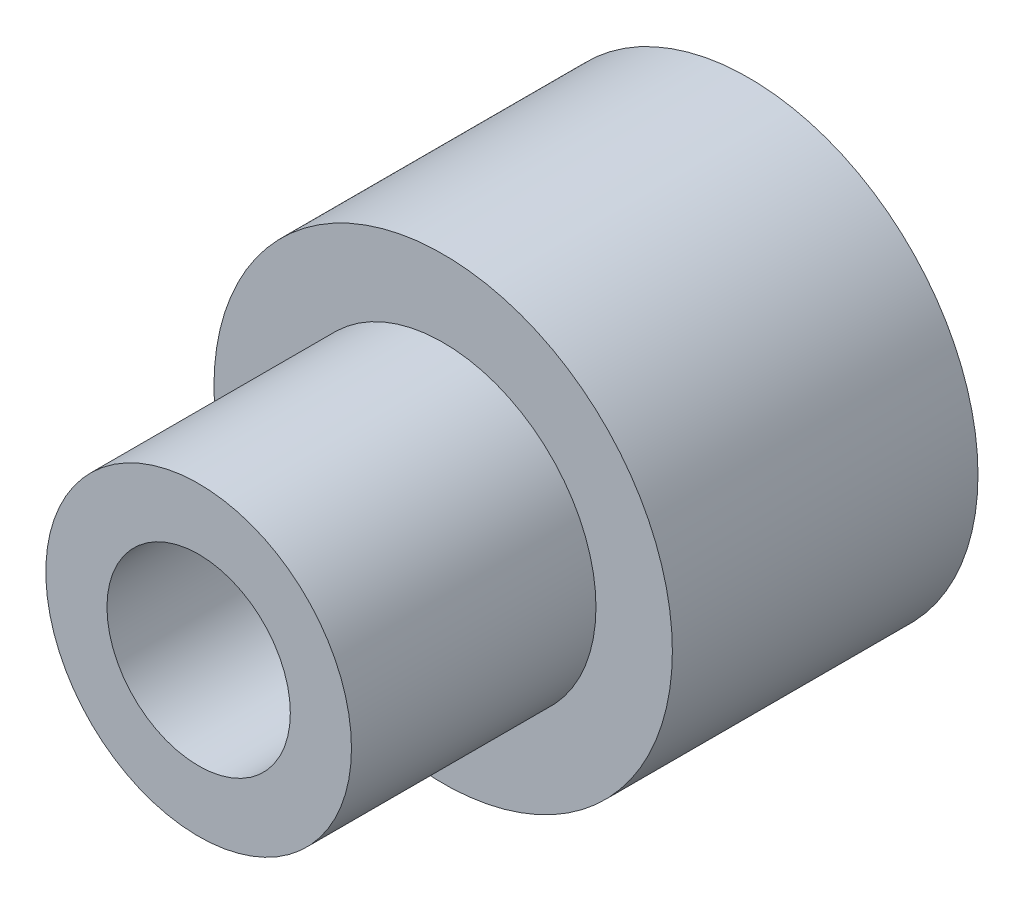
ISO-10303-21;
HEADER;
FILE_DESCRIPTION(('STEP AP214'),'2;1');
FILE_NAME('part.step','',(''),(''),'','','');
FILE_SCHEMA(('AUTOMOTIVE_DESIGN { 1 0 10303 214 1 1 1 1 }'));
ENDSEC;
DATA;
#1=APPLICATION_CONTEXT('core data for automotive mechanical design processes');
#2=APPLICATION_PROTOCOL_DEFINITION('international standard','automotive_design',2000,#1);
#3=PRODUCT_CONTEXT('',#1,'mechanical');
#4=PRODUCT('Part','Part','',(#3));
#5=PRODUCT_RELATED_PRODUCT_CATEGORY('part','',(#4));
#6=PRODUCT_DEFINITION_FORMATION('','',#4);
#7=PRODUCT_DEFINITION_CONTEXT('part definition',#1,'design');
#8=PRODUCT_DEFINITION('design','',#6,#7);
#9=PRODUCT_DEFINITION_SHAPE('','',#8);
#10=(LENGTH_UNIT() NAMED_UNIT(*) SI_UNIT(.MILLI.,.METRE.));
#11=(NAMED_UNIT(*) PLANE_ANGLE_UNIT() SI_UNIT($,.RADIAN.));
#12=(NAMED_UNIT(*) SI_UNIT($,.STERADIAN.) SOLID_ANGLE_UNIT());
#13=UNCERTAINTY_MEASURE_WITH_UNIT(LENGTH_MEASURE(1.E-05),#10,'distance_accuracy_value','');
#14=(GEOMETRIC_REPRESENTATION_CONTEXT(3) GLOBAL_UNCERTAINTY_ASSIGNED_CONTEXT((#13)) GLOBAL_UNIT_ASSIGNED_CONTEXT((#10,
#11,#12)) REPRESENTATION_CONTEXT('',''));
#15=CARTESIAN_POINT('',(0.,0.,0.));
#16=DIRECTION('',(0.,0.,1.));
#17=DIRECTION('',(1.,0.,0.));
#18=AXIS2_PLACEMENT_3D('',#15,#16,#17);
#19=CARTESIAN_POINT('',(0.,0.,10.));
#20=DIRECTION('',(0.,0.,-1.));
#21=DIRECTION('',(-1.,0.,0.));
#22=AXIS2_PLACEMENT_3D('',#19,#20,#21);
#23=CYLINDRICAL_SURFACE('',#22,7.5);
#24=CARTESIAN_POINT('',(0.,0.,10.));
#25=DIRECTION('',(0.,0.,1.));
#26=DIRECTION('',(1.,0.,0.));
#27=AXIS2_PLACEMENT_3D('',#24,#25,#26);
#28=CIRCLE('',#27,7.5);
#29=CARTESIAN_POINT('',(7.5,0.,10.));
#30=VERTEX_POINT('',#29);
#31=EDGE_CURVE('E44',#30,#30,#28,.T.);
#32=ORIENTED_EDGE('',*,*,#31,.F.);
#33=EDGE_LOOP('',(#32));
#34=FACE_BOUND('',#33,.T.);
#35=CARTESIAN_POINT('',(0.,0.,0.));
#36=DIRECTION('',(0.,0.,1.));
#37=DIRECTION('',(1.,0.,0.));
#38=AXIS2_PLACEMENT_3D('',#35,#36,#37);
#39=CIRCLE('',#38,7.5);
#40=CARTESIAN_POINT('',(7.5,0.,0.));
#41=VERTEX_POINT('',#40);
#42=EDGE_CURVE('E49',#41,#41,#39,.T.);
#43=ORIENTED_EDGE('',*,*,#42,.T.);
#44=EDGE_LOOP('',(#43));
#45=FACE_BOUND('',#44,.T.);
#46=ADVANCED_FACE('F37',(#34,#45),#23,.T.);
#47=CARTESIAN_POINT('',(0.,0.,10.));
#48=DIRECTION('',(0.,0.,1.));
#49=DIRECTION('',(1.,0.,0.));
#50=AXIS2_PLACEMENT_3D('',#47,#48,#49);
#51=PLANE('',#50);
#52=CARTESIAN_POINT('',(0.,0.,10.));
#53=DIRECTION('',(0.,0.,1.));
#54=DIRECTION('',(1.,0.,0.));
#55=AXIS2_PLACEMENT_3D('',#52,#53,#54);
#56=CIRCLE('',#55,5.);
#57=CARTESIAN_POINT('',(5.,0.,10.));
#58=VERTEX_POINT('',#57);
#59=EDGE_CURVE('E57',#58,#58,#56,.T.);
#60=ORIENTED_EDGE('',*,*,#59,.F.);
#61=EDGE_LOOP('',(#60));
#62=FACE_BOUND('',#61,.T.);
#63=ORIENTED_EDGE('',*,*,#31,.T.);
#64=EDGE_LOOP('',(#63));
#65=FACE_BOUND('',#64,.T.);
#66=ADVANCED_FACE('F83',(#62,#65),#51,.T.);
#67=CARTESIAN_POINT('',(0.,0.,0.));
#68=DIRECTION('',(0.,0.,1.));
#69=DIRECTION('',(1.,0.,0.));
#70=AXIS2_PLACEMENT_3D('',#67,#68,#69);
#71=PLANE('',#70);
#72=ORIENTED_EDGE('',*,*,#42,.F.);
#73=EDGE_LOOP('',(#72));
#74=FACE_BOUND('',#73,.T.);
#75=ADVANCED_FACE('F74',(#74),#71,.F.);
#76=CARTESIAN_POINT('',(0.,0.,18.));
#77=DIRECTION('',(0.,0.,1.));
#78=DIRECTION('',(1.,0.,0.));
#79=AXIS2_PLACEMENT_3D('',#76,#77,#78);
#80=PLANE('',#79);
#81=CARTESIAN_POINT('',(0.,0.,18.));
#82=DIRECTION('',(0.,0.,1.));
#83=DIRECTION('',(1.,0.,0.));
#84=AXIS2_PLACEMENT_3D('',#81,#82,#83);
#85=CIRCLE('',#84,5.);
#86=CARTESIAN_POINT('',(5.,0.,18.));
#87=VERTEX_POINT('',#86);
#88=EDGE_CURVE('E55',#87,#87,#85,.T.);
#89=ORIENTED_EDGE('',*,*,#88,.T.);
#90=EDGE_LOOP('',(#89));
#91=FACE_BOUND('',#90,.T.);
#92=CARTESIAN_POINT('',(0.,0.,18.));
#93=DIRECTION('',(0.,0.,1.));
#94=DIRECTION('',(1.,0.,0.));
#95=AXIS2_PLACEMENT_3D('',#92,#93,#94);
#96=CIRCLE('',#95,3.);
#97=CARTESIAN_POINT('',(3.,0.,18.));
#98=VERTEX_POINT('',#97);
#99=EDGE_CURVE('E61',#98,#98,#96,.T.);
#100=ORIENTED_EDGE('',*,*,#99,.F.);
#101=EDGE_LOOP('',(#100));
#102=FACE_BOUND('',#101,.T.);
#103=ADVANCED_FACE('F71',(#91,#102),#80,.T.);
#104=CARTESIAN_POINT('',(0.,0.,18.));
#105=DIRECTION('',(0.,0.,-1.));
#106=DIRECTION('',(-1.,0.,0.));
#107=AXIS2_PLACEMENT_3D('',#104,#105,#106);
#108=CYLINDRICAL_SURFACE('',#107,5.);
#109=ORIENTED_EDGE('',*,*,#88,.F.);
#110=EDGE_LOOP('',(#109));
#111=FACE_BOUND('',#110,.T.);
#112=ORIENTED_EDGE('',*,*,#59,.T.);
#113=EDGE_LOOP('',(#112));
#114=FACE_BOUND('',#113,.T.);
#115=ADVANCED_FACE('F73',(#111,#114),#108,.T.);
#116=CARTESIAN_POINT('',(0.,0.,18.));
#117=DIRECTION('',(0.,0.,-1.));
#118=DIRECTION('',(-1.,0.,0.));
#119=AXIS2_PLACEMENT_3D('',#116,#117,#118);
#120=CYLINDRICAL_SURFACE('',#119,3.);
#121=ORIENTED_EDGE('',*,*,#99,.T.);
#122=EDGE_LOOP('',(#121));
#123=FACE_BOUND('',#122,.T.);
#124=CARTESIAN_POINT('',(0.,0.,10.));
#125=DIRECTION('',(0.,0.,1.));
#126=DIRECTION('',(1.,0.,0.));
#127=AXIS2_PLACEMENT_3D('',#124,#125,#126);
#128=CIRCLE('',#127,3.);
#129=CARTESIAN_POINT('',(3.,0.,10.));
#130=VERTEX_POINT('',#129);
#131=EDGE_CURVE('E10',#130,#130,#128,.F.);
#132=ORIENTED_EDGE('',*,*,#131,.T.);
#133=EDGE_LOOP('',(#132));
#134=FACE_BOUND('',#133,.T.);
#135=ADVANCED_FACE('F69',(#123,#134),#120,.F.);
#136=ORIENTED_EDGE('',*,*,#131,.F.);
#137=EDGE_LOOP('',(#136));
#138=FACE_BOUND('',#137,.T.);
#139=ADVANCED_FACE('F93',(#138),#51,.T.);
#140=CLOSED_SHELL('',(#46,#66,#75,#103,#115,#135,#139));
#141=MANIFOLD_SOLID_BREP('B2',#140);
#142=ADVANCED_BREP_SHAPE_REPRESENTATION('',(#18,#141),#14);
#143=SHAPE_DEFINITION_REPRESENTATION(#9,#142);
ENDSEC;
END-ISO-10303-21;
